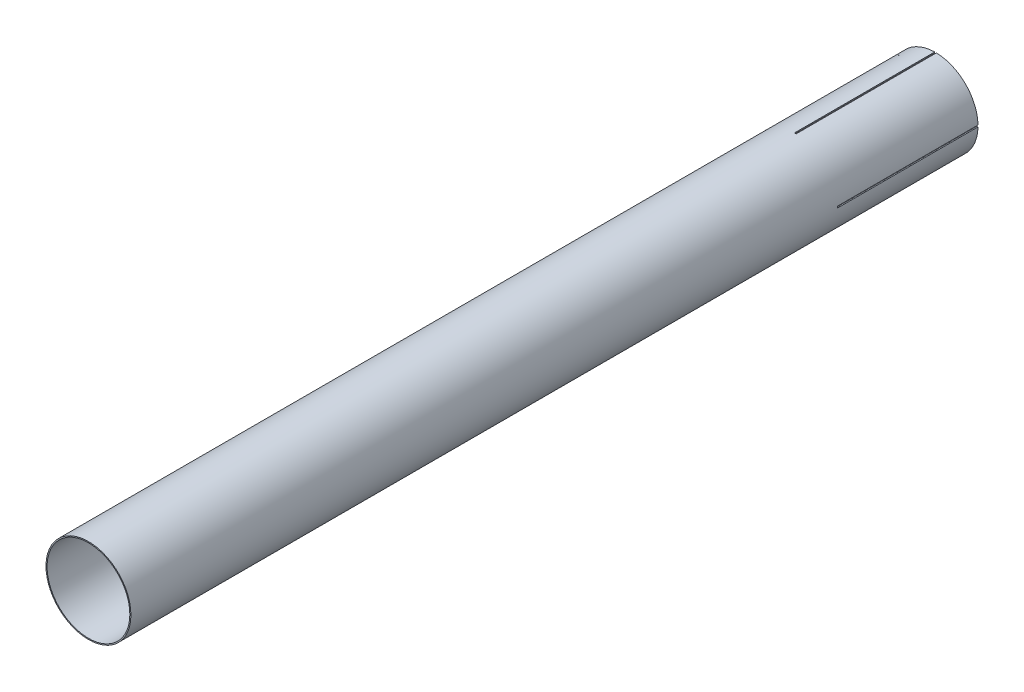
ISO-10303-21;
HEADER;
FILE_DESCRIPTION(('STEP AP214'),'2;1');
FILE_NAME('part.step','',(''),(''),'','','');
FILE_SCHEMA(('AUTOMOTIVE_DESIGN { 1 0 10303 214 1 1 1 1 }'));
ENDSEC;
DATA;
#1=APPLICATION_CONTEXT('core data for automotive mechanical design processes');
#2=APPLICATION_PROTOCOL_DEFINITION('international standard','automotive_design',2000,#1);
#3=PRODUCT_CONTEXT('',#1,'mechanical');
#4=PRODUCT('Part','Part','',(#3));
#5=PRODUCT_RELATED_PRODUCT_CATEGORY('part','',(#4));
#6=PRODUCT_DEFINITION_FORMATION('','',#4);
#7=PRODUCT_DEFINITION_CONTEXT('part definition',#1,'design');
#8=PRODUCT_DEFINITION('design','',#6,#7);
#9=PRODUCT_DEFINITION_SHAPE('','',#8);
#10=(LENGTH_UNIT() NAMED_UNIT(*) SI_UNIT(.MILLI.,.METRE.));
#11=(NAMED_UNIT(*) PLANE_ANGLE_UNIT() SI_UNIT($,.RADIAN.));
#12=(NAMED_UNIT(*) SI_UNIT($,.STERADIAN.) SOLID_ANGLE_UNIT());
#13=UNCERTAINTY_MEASURE_WITH_UNIT(LENGTH_MEASURE(1.E-05),#10,'distance_accuracy_value','');
#14=(GEOMETRIC_REPRESENTATION_CONTEXT(3) GLOBAL_UNCERTAINTY_ASSIGNED_CONTEXT((#13)) GLOBAL_UNIT_ASSIGNED_CONTEXT((#10,
#11,#12)) REPRESENTATION_CONTEXT('',''));
#15=CARTESIAN_POINT('',(0.,0.,0.));
#16=DIRECTION('',(0.,0.,1.));
#17=DIRECTION('',(1.,0.,0.));
#18=AXIS2_PLACEMENT_3D('',#15,#16,#17);
#19=CARTESIAN_POINT('',(0.,0.,0.));
#20=DIRECTION('',(0.,0.,1.));
#21=DIRECTION('',(1.,0.,0.));
#22=AXIS2_PLACEMENT_3D('',#19,#20,#21);
#23=PLANE('',#22);
#24=DIRECTION('',(1.,0.,0.));
#25=VECTOR('',#24,1.);
#26=CARTESIAN_POINT('',(74.2,1.5,0.));
#27=LINE('',#26,#25);
#28=CARTESIAN_POINT('',(76.1852347899513,1.5,0.));
#29=VERTEX_POINT('',#28);
#30=CARTESIAN_POINT('',(78.1856124872089,1.5,0.));
#31=VERTEX_POINT('',#30);
#32=EDGE_CURVE('E68',#29,#31,#27,.T.);
#33=ORIENTED_EDGE('',*,*,#32,.F.);
#34=CARTESIAN_POINT('',(0.,0.,0.));
#35=DIRECTION('',(0.,0.,1.));
#36=DIRECTION('',(1.,0.,0.));
#37=AXIS2_PLACEMENT_3D('',#34,#35,#36);
#38=CIRCLE('',#37,76.2);
#39=CARTESIAN_POINT('',(1.5000000000008,76.1852347899513,0.));
#40=VERTEX_POINT('',#39);
#41=EDGE_CURVE('E361',#29,#40,#38,.T.);
#42=ORIENTED_EDGE('',*,*,#41,.T.);
#43=DIRECTION('',(0.,1.,0.));
#44=VECTOR('',#43,1.);
#45=CARTESIAN_POINT('',(1.50000000000078,74.2,0.));
#46=LINE('',#45,#44);
#47=CARTESIAN_POINT('',(1.50000000000082,78.1856124872089,0.));
#48=VERTEX_POINT('',#47);
#49=EDGE_CURVE('E224',#40,#48,#46,.T.);
#50=ORIENTED_EDGE('',*,*,#49,.T.);
#51=CARTESIAN_POINT('',(0.,0.,0.));
#52=DIRECTION('',(0.,0.,1.));
#53=DIRECTION('',(1.,0.,0.));
#54=AXIS2_PLACEMENT_3D('',#51,#52,#53);
#55=CIRCLE('',#54,78.2);
#56=EDGE_CURVE('E371',#31,#48,#55,.T.);
#57=ORIENTED_EDGE('',*,*,#56,.F.);
#58=EDGE_LOOP('',(#33,#42,#50,#57));
#59=FACE_BOUND('',#58,.T.);
#60=ADVANCED_FACE('F44',(#59),#23,.F.);
#61=CARTESIAN_POINT('',(1.49999999999973,-76.1852347899513,0.));
#62=VERTEX_POINT('',#61);
#63=CARTESIAN_POINT('',(76.1852347899513,-1.5,0.));
#64=VERTEX_POINT('',#63);
#65=EDGE_CURVE('E355',#62,#64,#38,.T.);
#66=ORIENTED_EDGE('',*,*,#65,.T.);
#67=DIRECTION('',(1.,0.,0.));
#68=VECTOR('',#67,1.);
#69=CARTESIAN_POINT('',(74.2,-1.5,0.));
#70=LINE('',#69,#68);
#71=CARTESIAN_POINT('',(78.1856124872089,-1.5,0.));
#72=VERTEX_POINT('',#71);
#73=EDGE_CURVE('E301',#64,#72,#70,.T.);
#74=ORIENTED_EDGE('',*,*,#73,.T.);
#75=CARTESIAN_POINT('',(1.49999999999973,-78.1856124872089,0.));
#76=VERTEX_POINT('',#75);
#77=EDGE_CURVE('E360',#76,#72,#55,.T.);
#78=ORIENTED_EDGE('',*,*,#77,.F.);
#79=DIRECTION('',(0.,-1.,0.));
#80=VECTOR('',#79,1.);
#81=CARTESIAN_POINT('',(1.49999999999974,-74.2,0.));
#82=LINE('',#81,#80);
#83=EDGE_CURVE('E283',#62,#76,#82,.T.);
#84=ORIENTED_EDGE('',*,*,#83,.F.);
#85=EDGE_LOOP('',(#66,#74,#78,#84));
#86=FACE_BOUND('',#85,.T.);
#87=ADVANCED_FACE('F438',(#86),#23,.F.);
#88=CARTESIAN_POINT('',(-76.1852347899513,-1.5,0.));
#89=VERTEX_POINT('',#88);
#90=CARTESIAN_POINT('',(-1.50000000000027,-76.1852347899513,0.));
#91=VERTEX_POINT('',#90);
#92=EDGE_CURVE('E476',#89,#91,#38,.T.);
#93=ORIENTED_EDGE('',*,*,#92,.T.);
#94=DIRECTION('',(0.,-1.,0.));
#95=VECTOR('',#94,1.);
#96=CARTESIAN_POINT('',(-1.50000000000026,-74.2,0.));
#97=LINE('',#96,#95);
#98=CARTESIAN_POINT('',(-1.50000000000027,-78.1856124872089,0.));
#99=VERTEX_POINT('',#98);
#100=EDGE_CURVE('E275',#91,#99,#97,.T.);
#101=ORIENTED_EDGE('',*,*,#100,.T.);
#102=CARTESIAN_POINT('',(-78.1856124872089,-1.5,0.));
#103=VERTEX_POINT('',#102);
#104=EDGE_CURVE('E443',#103,#99,#55,.T.);
#105=ORIENTED_EDGE('',*,*,#104,.F.);
#106=DIRECTION('',(-1.,0.,0.));
#107=VECTOR('',#106,1.);
#108=CARTESIAN_POINT('',(-74.2,-1.5,0.));
#109=LINE('',#108,#107);
#110=EDGE_CURVE('E257',#89,#103,#109,.T.);
#111=ORIENTED_EDGE('',*,*,#110,.F.);
#112=EDGE_LOOP('',(#93,#101,#105,#111));
#113=FACE_BOUND('',#112,.T.);
#114=ADVANCED_FACE('F482',(#113),#23,.F.);
#115=CARTESIAN_POINT('',(-1.4999999999992,76.1852347899513,0.));
#116=VERTEX_POINT('',#115);
#117=CARTESIAN_POINT('',(-76.1852347899513,1.5,0.));
#118=VERTEX_POINT('',#117);
#119=EDGE_CURVE('E365',#116,#118,#38,.T.);
#120=ORIENTED_EDGE('',*,*,#119,.T.);
#121=DIRECTION('',(-1.,0.,0.));
#122=VECTOR('',#121,1.);
#123=CARTESIAN_POINT('',(-74.2,1.5,0.));
#124=LINE('',#123,#122);
#125=CARTESIAN_POINT('',(-78.1856124872089,1.5,0.));
#126=VERTEX_POINT('',#125);
#127=EDGE_CURVE('E249',#118,#126,#124,.T.);
#128=ORIENTED_EDGE('',*,*,#127,.T.);
#129=CARTESIAN_POINT('',(-1.49999999999918,78.1856124872089,0.));
#130=VERTEX_POINT('',#129);
#131=EDGE_CURVE('E375',#130,#126,#55,.T.);
#132=ORIENTED_EDGE('',*,*,#131,.F.);
#133=DIRECTION('',(0.,1.,0.));
#134=VECTOR('',#133,1.);
#135=CARTESIAN_POINT('',(-1.49999999999922,74.2,0.));
#136=LINE('',#135,#134);
#137=EDGE_CURVE('E218',#116,#130,#136,.T.);
#138=ORIENTED_EDGE('',*,*,#137,.F.);
#139=EDGE_LOOP('',(#120,#128,#132,#138));
#140=FACE_BOUND('',#139,.T.);
#141=ADVANCED_FACE('F455',(#140),#23,.F.);
#142=CARTESIAN_POINT('',(0.,0.,1560.));
#143=DIRECTION('',(0.,0.,-1.));
#144=DIRECTION('',(-1.,0.,0.));
#145=AXIS2_PLACEMENT_3D('',#142,#143,#144);
#146=CYLINDRICAL_SURFACE('',#145,78.2);
#147=CARTESIAN_POINT('',(0.,0.,1560.));
#148=DIRECTION('',(0.,0.,1.));
#149=DIRECTION('',(1.,0.,0.));
#150=AXIS2_PLACEMENT_3D('',#147,#148,#149);
#151=CIRCLE('',#150,78.2);
#152=CARTESIAN_POINT('',(78.2,0.,1560.));
#153=VERTEX_POINT('',#152);
#154=EDGE_CURVE('E366',#153,#153,#151,.T.);
#155=ORIENTED_EDGE('',*,*,#154,.F.);
#156=EDGE_LOOP('',(#155));
#157=FACE_BOUND('',#156,.T.);
#158=DIRECTION('',(0.,0.,-1.));
#159=VECTOR('',#158,1.);
#160=CARTESIAN_POINT('',(78.1856124872089,1.5,1560.));
#161=LINE('',#160,#159);
#162=CARTESIAN_POINT('',(78.185612487209,1.5,258.364789716416));
#163=VERTEX_POINT('',#162);
#164=EDGE_CURVE('E352',#31,#163,#161,.F.);
#165=ORIENTED_EDGE('',*,*,#164,.F.);
#166=ORIENTED_EDGE('',*,*,#56,.T.);
#167=DIRECTION('',(0.,0.,-1.));
#168=VECTOR('',#167,1.);
#169=CARTESIAN_POINT('',(1.50000000000082,78.1856124872089,1560.));
#170=LINE('',#169,#168);
#171=CARTESIAN_POINT('',(1.50000000000082,78.185612487209,258.364789716416));
#172=VERTEX_POINT('',#171);
#173=EDGE_CURVE('E316',#48,#172,#170,.F.);
#174=ORIENTED_EDGE('',*,*,#173,.T.);
#175=CARTESIAN_POINT('',(0.,0.,322.75294117647));
#176=DIRECTION('',(0.,0.6357072528611,0.77193023561705));
#177=DIRECTION('',(0.,0.77193023561705,-0.6357072528611));
#178=AXIS2_PLACEMENT_3D('',#175,#176,#177);
#179=ELLIPSE('',#178,101.304491509508,78.2);
#180=CARTESIAN_POINT('',(-1.49999999999918,78.185612487209,258.364789716416));
#181=VERTEX_POINT('',#180);
#182=EDGE_CURVE('E203',#172,#181,#179,.T.);
#183=ORIENTED_EDGE('',*,*,#182,.T.);
#184=DIRECTION('',(0.,0.,-1.));
#185=VECTOR('',#184,1.);
#186=CARTESIAN_POINT('',(-1.49999999999918,78.1856124872089,1560.));
#187=LINE('',#186,#185);
#188=EDGE_CURVE('E319',#130,#181,#187,.F.);
#189=ORIENTED_EDGE('',*,*,#188,.F.);
#190=ORIENTED_EDGE('',*,*,#131,.T.);
#191=DIRECTION('',(0.,0.,-1.));
#192=VECTOR('',#191,1.);
#193=CARTESIAN_POINT('',(-78.1856124872089,1.5,1560.));
#194=LINE('',#193,#192);
#195=CARTESIAN_POINT('',(-78.185612487209,1.5,258.364789716416));
#196=VERTEX_POINT('',#195);
#197=EDGE_CURVE('E326',#126,#196,#194,.F.);
#198=ORIENTED_EDGE('',*,*,#197,.T.);
#199=CARTESIAN_POINT('',(0.,0.,322.75294117647));
#200=DIRECTION('',(-0.6357072528611,0.,0.77193023561705));
#201=DIRECTION('',(-0.77193023561705,0.,-0.6357072528611));
#202=AXIS2_PLACEMENT_3D('',#199,#200,#201);
#203=ELLIPSE('',#202,101.304491509508,78.2);
#204=CARTESIAN_POINT('',(-78.185612487209,-1.5,258.364789716416));
#205=VERTEX_POINT('',#204);
#206=EDGE_CURVE('E322',#196,#205,#203,.T.);
#207=ORIENTED_EDGE('',*,*,#206,.T.);
#208=DIRECTION('',(0.,0.,-1.));
#209=VECTOR('',#208,1.);
#210=CARTESIAN_POINT('',(-78.1856124872089,-1.5,1560.));
#211=LINE('',#210,#209);
#212=EDGE_CURVE('E330',#103,#205,#211,.F.);
#213=ORIENTED_EDGE('',*,*,#212,.F.);
#214=ORIENTED_EDGE('',*,*,#104,.T.);
#215=DIRECTION('',(0.,0.,-1.));
#216=VECTOR('',#215,1.);
#217=CARTESIAN_POINT('',(-1.50000000000027,-78.1856124872089,1560.));
#218=LINE('',#217,#216);
#219=CARTESIAN_POINT('',(-1.50000000000027,-78.185612487209,258.364789716416));
#220=VERTEX_POINT('',#219);
#221=EDGE_CURVE('E337',#99,#220,#218,.F.);
#222=ORIENTED_EDGE('',*,*,#221,.T.);
#223=CARTESIAN_POINT('',(0.,0.,322.75294117647));
#224=DIRECTION('',(0.,-0.6357072528611,0.77193023561705));
#225=DIRECTION('',(0.,-0.77193023561705,-0.6357072528611));
#226=AXIS2_PLACEMENT_3D('',#223,#224,#225);
#227=ELLIPSE('',#226,101.304491509508,78.2);
#228=CARTESIAN_POINT('',(1.49999999999973,-78.185612487209,258.364789716416));
#229=VERTEX_POINT('',#228);
#230=EDGE_CURVE('E333',#220,#229,#227,.T.);
#231=ORIENTED_EDGE('',*,*,#230,.T.);
#232=DIRECTION('',(0.,0.,-1.));
#233=VECTOR('',#232,1.);
#234=CARTESIAN_POINT('',(1.49999999999973,-78.1856124872089,1560.));
#235=LINE('',#234,#233);
#236=EDGE_CURVE('E341',#76,#229,#235,.F.);
#237=ORIENTED_EDGE('',*,*,#236,.F.);
#238=ORIENTED_EDGE('',*,*,#77,.T.);
#239=DIRECTION('',(0.,0.,-1.));
#240=VECTOR('',#239,1.);
#241=CARTESIAN_POINT('',(78.1856124872089,-1.5,1560.));
#242=LINE('',#241,#240);
#243=CARTESIAN_POINT('',(78.185612487209,-1.5,258.364789716416));
#244=VERTEX_POINT('',#243);
#245=EDGE_CURVE('E348',#72,#244,#242,.F.);
#246=ORIENTED_EDGE('',*,*,#245,.T.);
#247=CARTESIAN_POINT('',(0.,0.,322.75294117647));
#248=DIRECTION('',(0.6357072528611,0.,0.77193023561705));
#249=DIRECTION('',(0.77193023561705,0.,-0.6357072528611));
#250=AXIS2_PLACEMENT_3D('',#247,#248,#249);
#251=ELLIPSE('',#250,101.304491509508,78.2);
#252=EDGE_CURVE('E344',#244,#163,#251,.T.);
#253=ORIENTED_EDGE('',*,*,#252,.T.);
#254=EDGE_LOOP('',(#165,#166,#174,#183,#189,#190,#198,#207,#213,#214,#222,#231,#237,#238,#246,#253));
#255=FACE_BOUND('',#254,.T.);
#256=ADVANCED_FACE('F46',(#157,#255),#146,.T.);
#257=CARTESIAN_POINT('',(0.,0.,1560.));
#258=DIRECTION('',(0.,0.,-1.));
#259=DIRECTION('',(-1.,0.,0.));
#260=AXIS2_PLACEMENT_3D('',#257,#258,#259);
#261=CYLINDRICAL_SURFACE('',#260,76.2);
#262=DIRECTION('',(0.,0.,-1.));
#263=VECTOR('',#262,1.);
#264=CARTESIAN_POINT('',(-1.50000000000027,-76.1852347899513,1560.));
#265=LINE('',#264,#263);
#266=CARTESIAN_POINT('',(-1.50000000000027,-76.1852347899513,260.));
#267=VERTEX_POINT('',#266);
#268=EDGE_CURVE('E11',#91,#267,#265,.F.);
#269=ORIENTED_EDGE('',*,*,#268,.F.);
#270=ORIENTED_EDGE('',*,*,#92,.F.);
#271=DIRECTION('',(0.,0.,-1.));
#272=VECTOR('',#271,1.);
#273=CARTESIAN_POINT('',(-76.1852347899513,-1.5,1560.));
#274=LINE('',#273,#272);
#275=CARTESIAN_POINT('',(-76.1852347899513,-1.5,260.));
#276=VERTEX_POINT('',#275);
#277=EDGE_CURVE('E391',#89,#276,#274,.F.);
#278=ORIENTED_EDGE('',*,*,#277,.T.);
#279=CARTESIAN_POINT('',(0.,0.,260.));
#280=DIRECTION('',(0.,0.,1.));
#281=DIRECTION('',(1.,0.,0.));
#282=AXIS2_PLACEMENT_3D('',#279,#280,#281);
#283=CIRCLE('',#282,76.2);
#284=CARTESIAN_POINT('',(-76.2,0.,260.));
#285=VERTEX_POINT('',#284);
#286=EDGE_CURVE('E388',#285,#276,#283,.T.);
#287=ORIENTED_EDGE('',*,*,#286,.F.);
#288=CARTESIAN_POINT('',(-76.1852347899513,1.5,260.));
#289=VERTEX_POINT('',#288);
#290=EDGE_CURVE('E385',#289,#285,#283,.T.);
#291=ORIENTED_EDGE('',*,*,#290,.F.);
#292=DIRECTION('',(0.,0.,-1.));
#293=VECTOR('',#292,1.);
#294=CARTESIAN_POINT('',(-76.1852347899513,1.5,1560.));
#295=LINE('',#294,#293);
#296=EDGE_CURVE('E382',#118,#289,#295,.F.);
#297=ORIENTED_EDGE('',*,*,#296,.F.);
#298=ORIENTED_EDGE('',*,*,#119,.F.);
#299=DIRECTION('',(0.,0.,-1.));
#300=VECTOR('',#299,1.);
#301=CARTESIAN_POINT('',(-1.4999999999992,76.1852347899513,1560.));
#302=LINE('',#301,#300);
#303=CARTESIAN_POINT('',(-1.4999999999992,76.1852347899513,260.));
#304=VERTEX_POINT('',#303);
#305=EDGE_CURVE('E370',#116,#304,#302,.F.);
#306=ORIENTED_EDGE('',*,*,#305,.T.);
#307=CARTESIAN_POINT('',(0.,0.,260.));
#308=DIRECTION('',(0.,0.,1.));
#309=DIRECTION('',(1.,0.,0.));
#310=AXIS2_PLACEMENT_3D('',#307,#308,#309);
#311=CIRCLE('',#310,76.2);
#312=CARTESIAN_POINT('',(7.9815263405954E-13,76.2,260.));
#313=VERTEX_POINT('',#312);
#314=EDGE_CURVE('E379',#313,#304,#311,.T.);
#315=ORIENTED_EDGE('',*,*,#314,.F.);
#316=CARTESIAN_POINT('',(1.5000000000008,76.1852347899513,260.));
#317=VERTEX_POINT('',#316);
#318=EDGE_CURVE('E215',#317,#313,#311,.T.);
#319=ORIENTED_EDGE('',*,*,#318,.F.);
#320=DIRECTION('',(0.,0.,-1.));
#321=VECTOR('',#320,1.);
#322=CARTESIAN_POINT('',(1.5000000000008,76.1852347899513,1560.));
#323=LINE('',#322,#321);
#324=EDGE_CURVE('E222',#40,#317,#323,.F.);
#325=ORIENTED_EDGE('',*,*,#324,.F.);
#326=ORIENTED_EDGE('',*,*,#41,.F.);
#327=DIRECTION('',(0.,0.,-1.));
#328=VECTOR('',#327,1.);
#329=CARTESIAN_POINT('',(76.1852347899513,1.5,1560.));
#330=LINE('',#329,#328);
#331=CARTESIAN_POINT('',(76.1852347899513,1.5,260.));
#332=VERTEX_POINT('',#331);
#333=EDGE_CURVE('E395',#29,#332,#330,.F.);
#334=ORIENTED_EDGE('',*,*,#333,.T.);
#335=CARTESIAN_POINT('',(0.,0.,260.));
#336=DIRECTION('',(0.,0.,1.));
#337=DIRECTION('',(1.,0.,0.));
#338=AXIS2_PLACEMENT_3D('',#335,#336,#337);
#339=CIRCLE('',#338,76.2);
#340=CARTESIAN_POINT('',(76.2,0.,260.));
#341=VERTEX_POINT('',#340);
#342=EDGE_CURVE('E60',#341,#332,#339,.T.);
#343=ORIENTED_EDGE('',*,*,#342,.F.);
#344=CARTESIAN_POINT('',(76.1852347899513,-1.5,260.));
#345=VERTEX_POINT('',#344);
#346=EDGE_CURVE('E401',#345,#341,#339,.T.);
#347=ORIENTED_EDGE('',*,*,#346,.F.);
#348=DIRECTION('',(0.,0.,-1.));
#349=VECTOR('',#348,1.);
#350=CARTESIAN_POINT('',(76.1852347899513,-1.5,1560.));
#351=LINE('',#350,#349);
#352=EDGE_CURVE('E402',#64,#345,#351,.F.);
#353=ORIENTED_EDGE('',*,*,#352,.F.);
#354=ORIENTED_EDGE('',*,*,#65,.F.);
#355=DIRECTION('',(0.,0.,-1.));
#356=VECTOR('',#355,1.);
#357=CARTESIAN_POINT('',(1.49999999999973,-76.1852347899513,1560.));
#358=LINE('',#357,#356);
#359=CARTESIAN_POINT('',(1.49999999999973,-76.1852347899513,260.));
#360=VERTEX_POINT('',#359);
#361=EDGE_CURVE('E405',#62,#360,#358,.F.);
#362=ORIENTED_EDGE('',*,*,#361,.T.);
#363=CARTESIAN_POINT('',(0.,0.,260.));
#364=DIRECTION('',(0.,0.,1.));
#365=DIRECTION('',(1.,0.,0.));
#366=AXIS2_PLACEMENT_3D('',#363,#364,#365);
#367=CIRCLE('',#366,76.2);
#368=CARTESIAN_POINT('',(-2.66050878019847E-13,-76.2,260.));
#369=VERTEX_POINT('',#368);
#370=EDGE_CURVE('E408',#369,#360,#367,.T.);
#371=ORIENTED_EDGE('',*,*,#370,.F.);
#372=EDGE_CURVE('E53',#267,#369,#367,.T.);
#373=ORIENTED_EDGE('',*,*,#372,.F.);
#374=EDGE_LOOP('',(#269,#270,#278,#287,#291,#297,#298,#306,#315,#319,#325,#326,#334,#343,#347,
#353,#354,#362,#371,#373));
#375=FACE_BOUND('',#374,.T.);
#376=CARTESIAN_POINT('',(0.,0.,1560.));
#377=DIRECTION('',(0.,0.,1.));
#378=DIRECTION('',(1.,0.,0.));
#379=AXIS2_PLACEMENT_3D('',#376,#377,#378);
#380=CIRCLE('',#379,76.2);
#381=CARTESIAN_POINT('',(76.2,0.,1560.));
#382=VERTEX_POINT('',#381);
#383=EDGE_CURVE('E356',#382,#382,#380,.T.);
#384=ORIENTED_EDGE('',*,*,#383,.T.);
#385=EDGE_LOOP('',(#384));
#386=FACE_BOUND('',#385,.T.);
#387=ADVANCED_FACE('F428',(#375,#386),#261,.F.);
#388=CARTESIAN_POINT('',(0.,0.,1560.));
#389=DIRECTION('',(0.,0.,1.));
#390=DIRECTION('',(1.,0.,0.));
#391=AXIS2_PLACEMENT_3D('',#388,#389,#390);
#392=PLANE('',#391);
#393=ORIENTED_EDGE('',*,*,#154,.T.);
#394=EDGE_LOOP('',(#393));
#395=FACE_BOUND('',#394,.T.);
#396=ORIENTED_EDGE('',*,*,#383,.F.);
#397=EDGE_LOOP('',(#396));
#398=FACE_BOUND('',#397,.T.);
#399=ADVANCED_FACE('F520',(#395,#398),#392,.T.);
#400=CARTESIAN_POINT('',(-1.5,0.,0.));
#401=DIRECTION('',(1.,0.,0.));
#402=DIRECTION('',(0.,1.,0.));
#403=AXIS2_PLACEMENT_3D('',#400,#401,#402);
#404=PLANE('',#403);
#405=ORIENTED_EDGE('',*,*,#188,.T.);
#406=DIRECTION('',(0.,-0.77193023561705,0.6357072528611));
#407=VECTOR('',#406,1.);
#408=CARTESIAN_POINT('',(-1.49999999999742,246.2,120.));
#409=LINE('',#408,#407);
#410=CARTESIAN_POINT('',(-1.4999999999992,76.2,260.));
#411=VERTEX_POINT('',#410);
#412=EDGE_CURVE('E208',#181,#411,#409,.T.);
#413=ORIENTED_EDGE('',*,*,#412,.T.);
#414=DIRECTION('',(0.,-1.,0.));
#415=VECTOR('',#414,1.);
#416=CARTESIAN_POINT('',(-1.4999999999992,76.2,260.));
#417=LINE('',#416,#415);
#418=EDGE_CURVE('E229',#411,#304,#417,.T.);
#419=ORIENTED_EDGE('',*,*,#418,.T.);
#420=ORIENTED_EDGE('',*,*,#305,.F.);
#421=ORIENTED_EDGE('',*,*,#137,.T.);
#422=EDGE_LOOP('',(#405,#413,#419,#420,#421));
#423=FACE_BOUND('',#422,.T.);
#424=ADVANCED_FACE('F524',(#423),#404,.T.);
#425=CARTESIAN_POINT('',(0.,0.,260.));
#426=DIRECTION('',(0.,0.,1.));
#427=DIRECTION('',(1.,0.,0.));
#428=AXIS2_PLACEMENT_3D('',#425,#426,#427);
#429=PLANE('',#428);
#430=ORIENTED_EDGE('',*,*,#314,.T.);
#431=ORIENTED_EDGE('',*,*,#418,.F.);
#432=DIRECTION('',(1.,0.,0.));
#433=VECTOR('',#432,1.);
#434=CARTESIAN_POINT('',(-1.4999999999992,76.2,260.));
#435=LINE('',#434,#433);
#436=EDGE_CURVE('E217',#411,#313,#435,.T.);
#437=ORIENTED_EDGE('',*,*,#436,.T.);
#438=EDGE_LOOP('',(#430,#431,#437));
#439=FACE_BOUND('',#438,.T.);
#440=ADVANCED_FACE('F561',(#439),#429,.F.);
#441=CARTESIAN_POINT('',(1.5,0.,0.));
#442=DIRECTION('',(1.,0.,0.));
#443=DIRECTION('',(0.,1.,0.));
#444=AXIS2_PLACEMENT_3D('',#441,#442,#443);
#445=PLANE('',#444);
#446=ORIENTED_EDGE('',*,*,#49,.F.);
#447=ORIENTED_EDGE('',*,*,#324,.T.);
#448=DIRECTION('',(0.,-1.,0.));
#449=VECTOR('',#448,1.);
#450=CARTESIAN_POINT('',(1.5000000000008,76.2,260.));
#451=LINE('',#450,#449);
#452=CARTESIAN_POINT('',(1.5000000000008,76.2,260.));
#453=VERTEX_POINT('',#452);
#454=EDGE_CURVE('E213',#453,#317,#451,.T.);
#455=ORIENTED_EDGE('',*,*,#454,.F.);
#456=DIRECTION('',(0.,-0.77193023561705,0.6357072528611));
#457=VECTOR('',#456,1.);
#458=CARTESIAN_POINT('',(1.50000000000258,246.2,120.));
#459=LINE('',#458,#457);
#460=EDGE_CURVE('E195',#172,#453,#459,.T.);
#461=ORIENTED_EDGE('',*,*,#460,.F.);
#462=ORIENTED_EDGE('',*,*,#173,.F.);
#463=EDGE_LOOP('',(#446,#447,#455,#461,#462));
#464=FACE_BOUND('',#463,.T.);
#465=ADVANCED_FACE('F221',(#464),#445,.F.);
#466=ORIENTED_EDGE('',*,*,#318,.T.);
#467=EDGE_CURVE('E199',#313,#453,#435,.T.);
#468=ORIENTED_EDGE('',*,*,#467,.T.);
#469=ORIENTED_EDGE('',*,*,#454,.T.);
#470=EDGE_LOOP('',(#466,#468,#469));
#471=FACE_BOUND('',#470,.T.);
#472=ADVANCED_FACE('F212',(#471),#429,.F.);
#473=CARTESIAN_POINT('',(-1.49999999999742,246.2,120.));
#474=DIRECTION('',(0.,0.6357072528611,0.77193023561705));
#475=DIRECTION('',(0.,-0.77193023561705,0.6357072528611));
#476=AXIS2_PLACEMENT_3D('',#473,#474,#475);
#477=PLANE('',#476);
#478=ORIENTED_EDGE('',*,*,#460,.T.);
#479=ORIENTED_EDGE('',*,*,#467,.F.);
#480=ORIENTED_EDGE('',*,*,#436,.F.);
#481=ORIENTED_EDGE('',*,*,#412,.F.);
#482=ORIENTED_EDGE('',*,*,#182,.F.);
#483=EDGE_LOOP('',(#478,#479,#480,#481,#482));
#484=FACE_BOUND('',#483,.T.);
#485=ADVANCED_FACE('F197',(#484),#477,.F.);
#486=CARTESIAN_POINT('',(0.,-1.5,0.));
#487=DIRECTION('',(0.,1.,0.));
#488=DIRECTION('',(-1.,0.,0.));
#489=AXIS2_PLACEMENT_3D('',#486,#487,#488);
#490=PLANE('',#489);
#491=ORIENTED_EDGE('',*,*,#212,.T.);
#492=DIRECTION('',(0.77193023561705,0.,0.6357072528611));
#493=VECTOR('',#492,1.);
#494=CARTESIAN_POINT('',(-246.2,-1.5,120.));
#495=LINE('',#494,#493);
#496=CARTESIAN_POINT('',(-76.2,-1.5,260.));
#497=VERTEX_POINT('',#496);
#498=EDGE_CURVE('E242',#205,#497,#495,.T.);
#499=ORIENTED_EDGE('',*,*,#498,.T.);
#500=DIRECTION('',(1.,0.,0.));
#501=VECTOR('',#500,1.);
#502=CARTESIAN_POINT('',(-76.2,-1.5,260.));
#503=LINE('',#502,#501);
#504=EDGE_CURVE('E253',#497,#276,#503,.T.);
#505=ORIENTED_EDGE('',*,*,#504,.T.);
#506=ORIENTED_EDGE('',*,*,#277,.F.);
#507=ORIENTED_EDGE('',*,*,#110,.T.);
#508=EDGE_LOOP('',(#491,#499,#505,#506,#507));
#509=FACE_BOUND('',#508,.T.);
#510=ADVANCED_FACE('F608',(#509),#490,.T.);
#511=CARTESIAN_POINT('',(0.,0.,260.));
#512=DIRECTION('',(0.,0.,1.));
#513=DIRECTION('',(0.,1.,0.));
#514=AXIS2_PLACEMENT_3D('',#511,#512,#513);
#515=PLANE('',#514);
#516=ORIENTED_EDGE('',*,*,#286,.T.);
#517=ORIENTED_EDGE('',*,*,#504,.F.);
#518=DIRECTION('',(0.,1.,0.));
#519=VECTOR('',#518,1.);
#520=CARTESIAN_POINT('',(-76.2,-1.5,260.));
#521=LINE('',#520,#519);
#522=EDGE_CURVE('E261',#497,#285,#521,.T.);
#523=ORIENTED_EDGE('',*,*,#522,.T.);
#524=EDGE_LOOP('',(#516,#517,#523));
#525=FACE_BOUND('',#524,.T.);
#526=ADVANCED_FACE('F617',(#525),#515,.F.);
#527=CARTESIAN_POINT('',(0.,1.5,0.));
#528=DIRECTION('',(0.,1.,0.));
#529=DIRECTION('',(-1.,0.,0.));
#530=AXIS2_PLACEMENT_3D('',#527,#528,#529);
#531=PLANE('',#530);
#532=ORIENTED_EDGE('',*,*,#127,.F.);
#533=ORIENTED_EDGE('',*,*,#296,.T.);
#534=DIRECTION('',(1.,0.,0.));
#535=VECTOR('',#534,1.);
#536=CARTESIAN_POINT('',(-76.2,1.5,260.));
#537=LINE('',#536,#535);
#538=CARTESIAN_POINT('',(-76.2,1.5,260.));
#539=VERTEX_POINT('',#538);
#540=EDGE_CURVE('E245',#539,#289,#537,.T.);
#541=ORIENTED_EDGE('',*,*,#540,.F.);
#542=DIRECTION('',(0.77193023561705,0.,0.6357072528611));
#543=VECTOR('',#542,1.);
#544=CARTESIAN_POINT('',(-246.2,1.5,120.));
#545=LINE('',#544,#543);
#546=EDGE_CURVE('E239',#196,#539,#545,.T.);
#547=ORIENTED_EDGE('',*,*,#546,.F.);
#548=ORIENTED_EDGE('',*,*,#197,.F.);
#549=EDGE_LOOP('',(#532,#533,#541,#547,#548));
#550=FACE_BOUND('',#549,.T.);
#551=ADVANCED_FACE('F459',(#550),#531,.F.);
#552=ORIENTED_EDGE('',*,*,#290,.T.);
#553=EDGE_CURVE('E260',#285,#539,#521,.T.);
#554=ORIENTED_EDGE('',*,*,#553,.T.);
#555=ORIENTED_EDGE('',*,*,#540,.T.);
#556=EDGE_LOOP('',(#552,#554,#555));
#557=FACE_BOUND('',#556,.T.);
#558=ADVANCED_FACE('F469',(#557),#515,.F.);
#559=CARTESIAN_POINT('',(-246.2,-1.5,120.));
#560=DIRECTION('',(-0.6357072528611,0.,0.77193023561705));
#561=DIRECTION('',(0.77193023561705,0.,0.6357072528611));
#562=AXIS2_PLACEMENT_3D('',#559,#560,#561);
#563=PLANE('',#562);
#564=ORIENTED_EDGE('',*,*,#546,.T.);
#565=ORIENTED_EDGE('',*,*,#553,.F.);
#566=ORIENTED_EDGE('',*,*,#522,.F.);
#567=ORIENTED_EDGE('',*,*,#498,.F.);
#568=ORIENTED_EDGE('',*,*,#206,.F.);
#569=EDGE_LOOP('',(#564,#565,#566,#567,#568));
#570=FACE_BOUND('',#569,.T.);
#571=ADVANCED_FACE('F465',(#570),#563,.F.);
#572=CARTESIAN_POINT('',(1.5,0.,0.));
#573=DIRECTION('',(-1.,0.,0.));
#574=DIRECTION('',(0.,-1.,0.));
#575=AXIS2_PLACEMENT_3D('',#572,#573,#574);
#576=PLANE('',#575);
#577=ORIENTED_EDGE('',*,*,#236,.T.);
#578=DIRECTION('',(0.,0.77193023561705,0.6357072528611));
#579=VECTOR('',#578,1.);
#580=CARTESIAN_POINT('',(1.49999999999914,-246.2,120.));
#581=LINE('',#580,#579);
#582=CARTESIAN_POINT('',(1.49999999999973,-76.2,260.));
#583=VERTEX_POINT('',#582);
#584=EDGE_CURVE('E268',#229,#583,#581,.T.);
#585=ORIENTED_EDGE('',*,*,#584,.T.);
#586=DIRECTION('',(0.,1.,0.));
#587=VECTOR('',#586,1.);
#588=CARTESIAN_POINT('',(1.49999999999973,-76.2,260.));
#589=LINE('',#588,#587);
#590=EDGE_CURVE('E279',#583,#360,#589,.T.);
#591=ORIENTED_EDGE('',*,*,#590,.T.);
#592=ORIENTED_EDGE('',*,*,#361,.F.);
#593=ORIENTED_EDGE('',*,*,#83,.T.);
#594=EDGE_LOOP('',(#577,#585,#591,#592,#593));
#595=FACE_BOUND('',#594,.T.);
#596=ADVANCED_FACE('F434',(#595),#576,.T.);
#597=CARTESIAN_POINT('',(0.,0.,260.));
#598=DIRECTION('',(0.,0.,1.));
#599=DIRECTION('',(-1.,0.,0.));
#600=AXIS2_PLACEMENT_3D('',#597,#598,#599);
#601=PLANE('',#600);
#602=ORIENTED_EDGE('',*,*,#370,.T.);
#603=ORIENTED_EDGE('',*,*,#590,.F.);
#604=DIRECTION('',(-1.,0.,0.));
#605=VECTOR('',#604,1.);
#606=CARTESIAN_POINT('',(1.49999999999973,-76.2,260.));
#607=LINE('',#606,#605);
#608=EDGE_CURVE('E287',#583,#369,#607,.T.);
#609=ORIENTED_EDGE('',*,*,#608,.T.);
#610=EDGE_LOOP('',(#602,#603,#609));
#611=FACE_BOUND('',#610,.T.);
#612=ADVANCED_FACE('F427',(#611),#601,.F.);
#613=CARTESIAN_POINT('',(-1.5,0.,0.));
#614=DIRECTION('',(-1.,0.,0.));
#615=DIRECTION('',(0.,-1.,0.));
#616=AXIS2_PLACEMENT_3D('',#613,#614,#615);
#617=PLANE('',#616);
#618=ORIENTED_EDGE('',*,*,#100,.F.);
#619=ORIENTED_EDGE('',*,*,#268,.T.);
#620=DIRECTION('',(0.,1.,0.));
#621=VECTOR('',#620,1.);
#622=CARTESIAN_POINT('',(-1.50000000000027,-76.2,260.));
#623=LINE('',#622,#621);
#624=CARTESIAN_POINT('',(-1.50000000000027,-76.2,260.));
#625=VERTEX_POINT('',#624);
#626=EDGE_CURVE('E271',#625,#267,#623,.T.);
#627=ORIENTED_EDGE('',*,*,#626,.F.);
#628=DIRECTION('',(0.,0.77193023561705,0.6357072528611));
#629=VECTOR('',#628,1.);
#630=CARTESIAN_POINT('',(-1.50000000000086,-246.2,120.));
#631=LINE('',#630,#629);
#632=EDGE_CURVE('E265',#220,#625,#631,.T.);
#633=ORIENTED_EDGE('',*,*,#632,.F.);
#634=ORIENTED_EDGE('',*,*,#221,.F.);
#635=EDGE_LOOP('',(#618,#619,#627,#633,#634));
#636=FACE_BOUND('',#635,.T.);
#637=ADVANCED_FACE('F486',(#636),#617,.F.);
#638=ORIENTED_EDGE('',*,*,#372,.T.);
#639=EDGE_CURVE('E286',#369,#625,#607,.T.);
#640=ORIENTED_EDGE('',*,*,#639,.T.);
#641=ORIENTED_EDGE('',*,*,#626,.T.);
#642=EDGE_LOOP('',(#638,#640,#641));
#643=FACE_BOUND('',#642,.T.);
#644=ADVANCED_FACE('F418',(#643),#601,.F.);
#645=CARTESIAN_POINT('',(1.49999999999914,-246.2,120.));
#646=DIRECTION('',(0.,-0.6357072528611,0.77193023561705));
#647=DIRECTION('',(0.,0.77193023561705,0.6357072528611));
#648=AXIS2_PLACEMENT_3D('',#645,#646,#647);
#649=PLANE('',#648);
#650=ORIENTED_EDGE('',*,*,#632,.T.);
#651=ORIENTED_EDGE('',*,*,#639,.F.);
#652=ORIENTED_EDGE('',*,*,#608,.F.);
#653=ORIENTED_EDGE('',*,*,#584,.F.);
#654=ORIENTED_EDGE('',*,*,#230,.F.);
#655=EDGE_LOOP('',(#650,#651,#652,#653,#654));
#656=FACE_BOUND('',#655,.T.);
#657=ADVANCED_FACE('F423',(#656),#649,.F.);
#658=CARTESIAN_POINT('',(0.,0.,260.));
#659=DIRECTION('',(0.,0.,1.));
#660=DIRECTION('',(0.,-1.,0.));
#661=AXIS2_PLACEMENT_3D('',#658,#659,#660);
#662=PLANE('',#661);
#663=ORIENTED_EDGE('',*,*,#342,.T.);
#664=DIRECTION('',(-1.,0.,0.));
#665=VECTOR('',#664,1.);
#666=CARTESIAN_POINT('',(76.2,1.5,260.));
#667=LINE('',#666,#665);
#668=CARTESIAN_POINT('',(76.2,1.5,260.));
#669=VERTEX_POINT('',#668);
#670=EDGE_CURVE('E305',#669,#332,#667,.T.);
#671=ORIENTED_EDGE('',*,*,#670,.F.);
#672=DIRECTION('',(0.,-1.,0.));
#673=VECTOR('',#672,1.);
#674=CARTESIAN_POINT('',(76.2,1.5,260.));
#675=LINE('',#674,#673);
#676=EDGE_CURVE('E311',#669,#341,#675,.T.);
#677=ORIENTED_EDGE('',*,*,#676,.T.);
#678=EDGE_LOOP('',(#663,#671,#677));
#679=FACE_BOUND('',#678,.T.);
#680=ADVANCED_FACE('F707',(#679),#662,.F.);
#681=CARTESIAN_POINT('',(0.,1.5,0.));
#682=DIRECTION('',(0.,-1.,0.));
#683=DIRECTION('',(1.,0.,0.));
#684=AXIS2_PLACEMENT_3D('',#681,#682,#683);
#685=PLANE('',#684);
#686=ORIENTED_EDGE('',*,*,#164,.T.);
#687=DIRECTION('',(-0.77193023561705,0.,0.6357072528611));
#688=VECTOR('',#687,1.);
#689=CARTESIAN_POINT('',(246.2,1.5,120.));
#690=LINE('',#689,#688);
#691=EDGE_CURVE('E294',#163,#669,#690,.T.);
#692=ORIENTED_EDGE('',*,*,#691,.T.);
#693=ORIENTED_EDGE('',*,*,#670,.T.);
#694=ORIENTED_EDGE('',*,*,#333,.F.);
#695=ORIENTED_EDGE('',*,*,#32,.T.);
#696=EDGE_LOOP('',(#686,#692,#693,#694,#695));
#697=FACE_BOUND('',#696,.T.);
#698=ADVANCED_FACE('F715',(#697),#685,.T.);
#699=CARTESIAN_POINT('',(0.,-1.5,0.));
#700=DIRECTION('',(0.,-1.,0.));
#701=DIRECTION('',(1.,0.,0.));
#702=AXIS2_PLACEMENT_3D('',#699,#700,#701);
#703=PLANE('',#702);
#704=ORIENTED_EDGE('',*,*,#73,.F.);
#705=ORIENTED_EDGE('',*,*,#352,.T.);
#706=DIRECTION('',(-1.,0.,0.));
#707=VECTOR('',#706,1.);
#708=CARTESIAN_POINT('',(76.2,-1.5,260.));
#709=LINE('',#708,#707);
#710=CARTESIAN_POINT('',(76.2,-1.5,260.));
#711=VERTEX_POINT('',#710);
#712=EDGE_CURVE('E297',#711,#345,#709,.T.);
#713=ORIENTED_EDGE('',*,*,#712,.F.);
#714=DIRECTION('',(-0.77193023561705,0.,0.6357072528611));
#715=VECTOR('',#714,1.);
#716=CARTESIAN_POINT('',(246.2,-1.5,120.));
#717=LINE('',#716,#715);
#718=EDGE_CURVE('E291',#244,#711,#717,.T.);
#719=ORIENTED_EDGE('',*,*,#718,.F.);
#720=ORIENTED_EDGE('',*,*,#245,.F.);
#721=EDGE_LOOP('',(#704,#705,#713,#719,#720));
#722=FACE_BOUND('',#721,.T.);
#723=ADVANCED_FACE('F728',(#722),#703,.F.);
#724=CARTESIAN_POINT('',(246.2,1.5,120.));
#725=DIRECTION('',(0.6357072528611,0.,0.77193023561705));
#726=DIRECTION('',(-0.77193023561705,0.,0.6357072528611));
#727=AXIS2_PLACEMENT_3D('',#724,#725,#726);
#728=PLANE('',#727);
#729=ORIENTED_EDGE('',*,*,#718,.T.);
#730=EDGE_CURVE('E310',#341,#711,#675,.T.);
#731=ORIENTED_EDGE('',*,*,#730,.F.);
#732=ORIENTED_EDGE('',*,*,#676,.F.);
#733=ORIENTED_EDGE('',*,*,#691,.F.);
#734=ORIENTED_EDGE('',*,*,#252,.F.);
#735=EDGE_LOOP('',(#729,#731,#732,#733,#734));
#736=FACE_BOUND('',#735,.T.);
#737=ADVANCED_FACE('F740',(#736),#728,.F.);
#738=ORIENTED_EDGE('',*,*,#346,.T.);
#739=ORIENTED_EDGE('',*,*,#730,.T.);
#740=ORIENTED_EDGE('',*,*,#712,.T.);
#741=EDGE_LOOP('',(#738,#739,#740));
#742=FACE_BOUND('',#741,.T.);
#743=ADVANCED_FACE('F717',(#742),#662,.F.);
#744=CLOSED_SHELL('',(#60,#87,#114,#141,#256,#387,#399,#424,#440,#465,#472,#485,#510,#526,#551,
#558,#571,#596,#612,#637,#644,#657,#680,#698,#723,#737,#743));
#745=MANIFOLD_SOLID_BREP('B2',#744);
#746=ADVANCED_BREP_SHAPE_REPRESENTATION('',(#18,#745),#14);
#747=SHAPE_DEFINITION_REPRESENTATION(#9,#746);
ENDSEC;
END-ISO-10303-21;
